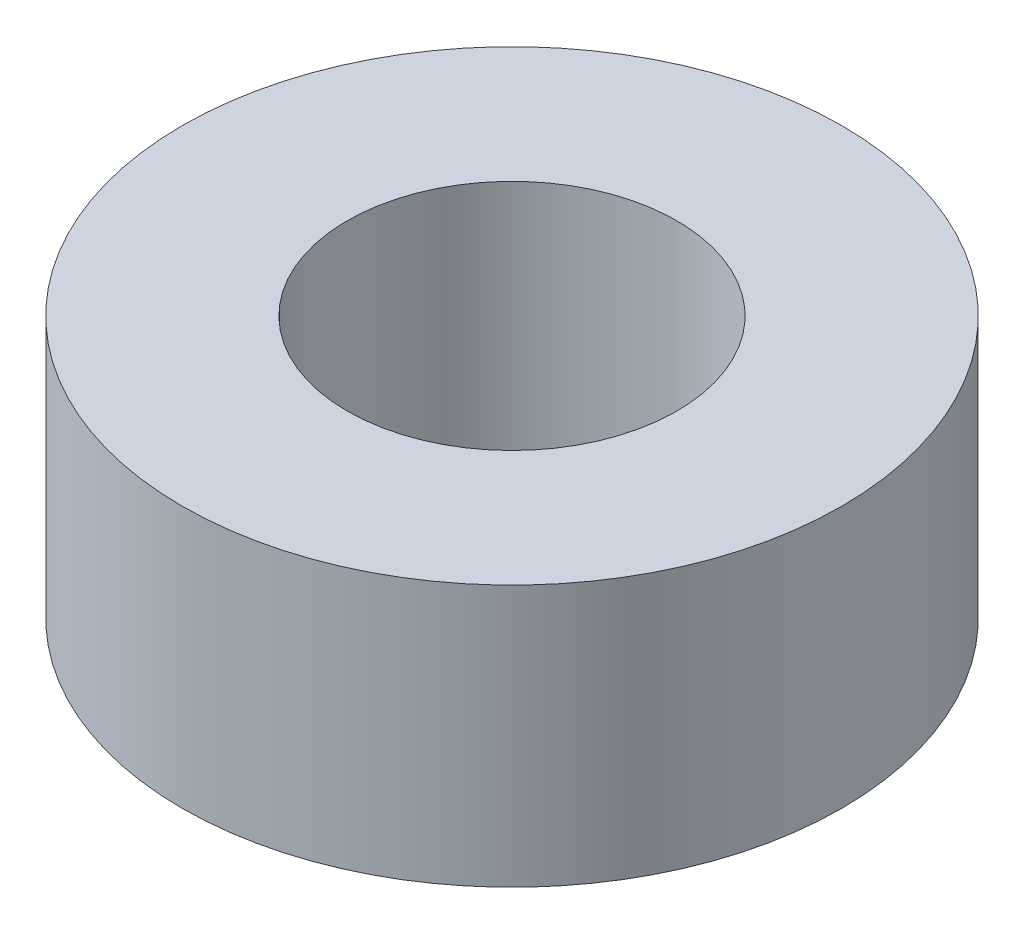
ISO-10303-21;
HEADER;
FILE_DESCRIPTION(('STEP AP214'),'2;1');
FILE_NAME('part.step','',(''),(''),'','','');
FILE_SCHEMA(('AUTOMOTIVE_DESIGN { 1 0 10303 214 1 1 1 1 }'));
ENDSEC;
DATA;
#1=APPLICATION_CONTEXT('core data for automotive mechanical design processes');
#2=APPLICATION_PROTOCOL_DEFINITION('international standard','automotive_design',2000,#1);
#3=PRODUCT_CONTEXT('',#1,'mechanical');
#4=PRODUCT('Part','Part','',(#3));
#5=PRODUCT_RELATED_PRODUCT_CATEGORY('part','',(#4));
#6=PRODUCT_DEFINITION_FORMATION('','',#4);
#7=PRODUCT_DEFINITION_CONTEXT('part definition',#1,'design');
#8=PRODUCT_DEFINITION('design','',#6,#7);
#9=PRODUCT_DEFINITION_SHAPE('','',#8);
#10=(LENGTH_UNIT() NAMED_UNIT(*) SI_UNIT(.MILLI.,.METRE.));
#11=(NAMED_UNIT(*) PLANE_ANGLE_UNIT() SI_UNIT($,.RADIAN.));
#12=(NAMED_UNIT(*) SI_UNIT($,.STERADIAN.) SOLID_ANGLE_UNIT());
#13=UNCERTAINTY_MEASURE_WITH_UNIT(LENGTH_MEASURE(1.E-05),#10,'distance_accuracy_value','');
#14=(GEOMETRIC_REPRESENTATION_CONTEXT(3) GLOBAL_UNCERTAINTY_ASSIGNED_CONTEXT((#13)) GLOBAL_UNIT_ASSIGNED_CONTEXT((#10,
#11,#12)) REPRESENTATION_CONTEXT('',''));
#15=CARTESIAN_POINT('',(0.,0.,0.));
#16=DIRECTION('',(0.,0.,1.));
#17=DIRECTION('',(1.,0.,0.));
#18=AXIS2_PLACEMENT_3D('',#15,#16,#17);
#19=CARTESIAN_POINT('',(0.,3.175,0.));
#20=DIRECTION('',(0.,1.,0.));
#21=DIRECTION('',(0.,0.,1.));
#22=AXIS2_PLACEMENT_3D('',#19,#20,#21);
#23=PLANE('',#22);
#24=CARTESIAN_POINT('',(0.,3.175,0.));
#25=DIRECTION('',(0.,1.,0.));
#26=DIRECTION('',(0.,0.,1.));
#27=AXIS2_PLACEMENT_3D('',#24,#25,#26);
#28=CIRCLE('',#27,8.);
#29=CARTESIAN_POINT('',(0.,3.175,8.));
#30=VERTEX_POINT('',#29);
#31=EDGE_CURVE('E10',#30,#30,#28,.T.);
#32=ORIENTED_EDGE('',*,*,#31,.T.);
#33=EDGE_LOOP('',(#32));
#34=FACE_BOUND('',#33,.T.);
#35=CARTESIAN_POINT('',(0.,3.175,0.));
#36=DIRECTION('',(0.,1.,0.));
#37=DIRECTION('',(0.,0.,1.));
#38=AXIS2_PLACEMENT_3D('',#35,#36,#37);
#39=CIRCLE('',#38,4.);
#40=CARTESIAN_POINT('',(0.,3.175,4.));
#41=VERTEX_POINT('',#40);
#42=EDGE_CURVE('E43',#41,#41,#39,.T.);
#43=ORIENTED_EDGE('',*,*,#42,.F.);
#44=EDGE_LOOP('',(#43));
#45=FACE_BOUND('',#44,.T.);
#46=ADVANCED_FACE('F32',(#34,#45),#23,.T.);
#47=CARTESIAN_POINT('',(0.,-3.175,0.));
#48=DIRECTION('',(0.,1.,0.));
#49=DIRECTION('',(0.,0.,1.));
#50=AXIS2_PLACEMENT_3D('',#47,#48,#49);
#51=PLANE('',#50);
#52=CARTESIAN_POINT('',(0.,-3.175,0.));
#53=DIRECTION('',(0.,1.,0.));
#54=DIRECTION('',(0.,0.,1.));
#55=AXIS2_PLACEMENT_3D('',#52,#53,#54);
#56=CIRCLE('',#55,8.);
#57=CARTESIAN_POINT('',(0.,-3.175,8.));
#58=VERTEX_POINT('',#57);
#59=EDGE_CURVE('E36',#58,#58,#56,.T.);
#60=ORIENTED_EDGE('',*,*,#59,.F.);
#61=EDGE_LOOP('',(#60));
#62=FACE_BOUND('',#61,.T.);
#63=CARTESIAN_POINT('',(0.,-3.175,0.));
#64=DIRECTION('',(0.,1.,0.));
#65=DIRECTION('',(0.,0.,1.));
#66=AXIS2_PLACEMENT_3D('',#63,#64,#65);
#67=CIRCLE('',#66,4.);
#68=CARTESIAN_POINT('',(0.,-3.175,4.));
#69=VERTEX_POINT('',#68);
#70=EDGE_CURVE('E45',#69,#69,#67,.T.);
#71=ORIENTED_EDGE('',*,*,#70,.T.);
#72=EDGE_LOOP('',(#71));
#73=FACE_BOUND('',#72,.T.);
#74=ADVANCED_FACE('F55',(#62,#73),#51,.F.);
#75=CARTESIAN_POINT('',(0.,3.175,0.));
#76=DIRECTION('',(0.,-1.,0.));
#77=DIRECTION('',(0.,0.,-1.));
#78=AXIS2_PLACEMENT_3D('',#75,#76,#77);
#79=CYLINDRICAL_SURFACE('',#78,8.);
#80=ORIENTED_EDGE('',*,*,#31,.F.);
#81=EDGE_LOOP('',(#80));
#82=FACE_BOUND('',#81,.T.);
#83=ORIENTED_EDGE('',*,*,#59,.T.);
#84=EDGE_LOOP('',(#83));
#85=FACE_BOUND('',#84,.T.);
#86=ADVANCED_FACE('F34',(#82,#85),#79,.T.);
#87=CARTESIAN_POINT('',(0.,3.175,0.));
#88=DIRECTION('',(0.,-1.,0.));
#89=DIRECTION('',(0.,0.,-1.));
#90=AXIS2_PLACEMENT_3D('',#87,#88,#89);
#91=CYLINDRICAL_SURFACE('',#90,4.);
#92=ORIENTED_EDGE('',*,*,#42,.T.);
#93=EDGE_LOOP('',(#92));
#94=FACE_BOUND('',#93,.T.);
#95=ORIENTED_EDGE('',*,*,#70,.F.);
#96=EDGE_LOOP('',(#95));
#97=FACE_BOUND('',#96,.T.);
#98=ADVANCED_FACE('F51',(#94,#97),#91,.F.);
#99=CLOSED_SHELL('',(#46,#74,#86,#98));
#100=MANIFOLD_SOLID_BREP('B2',#99);
#101=ADVANCED_BREP_SHAPE_REPRESENTATION('',(#18,#100),#14);
#102=SHAPE_DEFINITION_REPRESENTATION(#9,#101);
ENDSEC;
END-ISO-10303-21;
